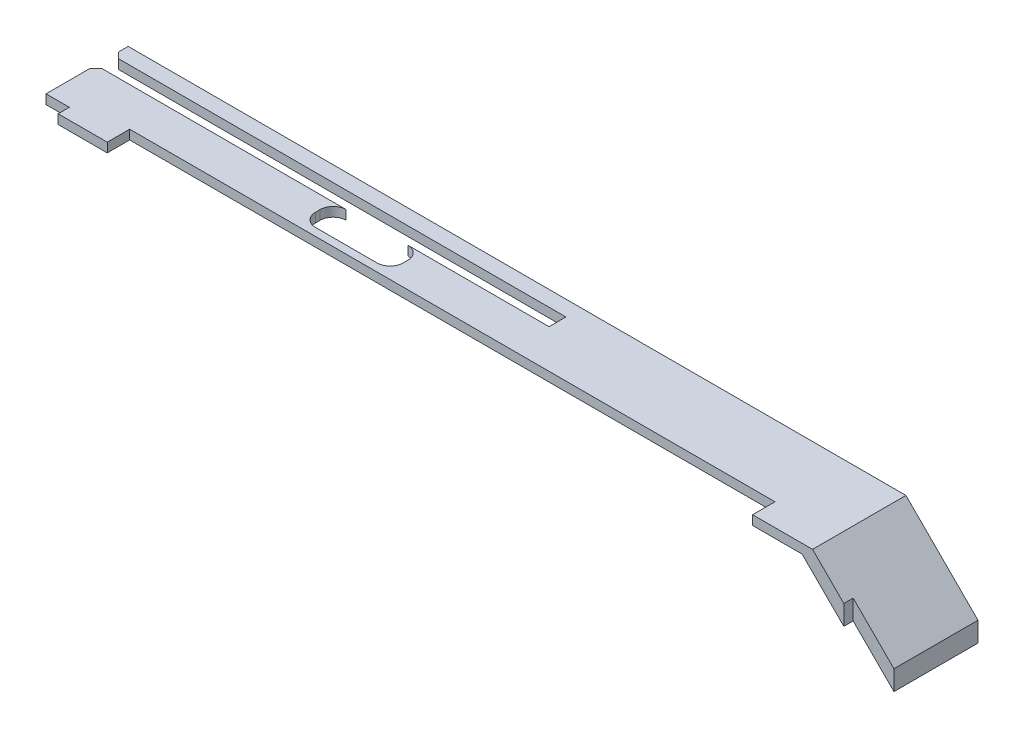
ISO-10303-21;
HEADER;
FILE_DESCRIPTION(('STEP AP214'),'2;1');
FILE_NAME('part.step','',(''),(''),'','','');
FILE_SCHEMA(('AUTOMOTIVE_DESIGN { 1 0 10303 214 1 1 1 1 }'));
ENDSEC;
DATA;
#1=APPLICATION_CONTEXT('core data for automotive mechanical design processes');
#2=APPLICATION_PROTOCOL_DEFINITION('international standard','automotive_design',2000,#1);
#3=PRODUCT_CONTEXT('',#1,'mechanical');
#4=PRODUCT('Part','Part','',(#3));
#5=PRODUCT_RELATED_PRODUCT_CATEGORY('part','',(#4));
#6=PRODUCT_DEFINITION_FORMATION('','',#4);
#7=PRODUCT_DEFINITION_CONTEXT('part definition',#1,'design');
#8=PRODUCT_DEFINITION('design','',#6,#7);
#9=PRODUCT_DEFINITION_SHAPE('','',#8);
#10=(LENGTH_UNIT() NAMED_UNIT(*) SI_UNIT(.MILLI.,.METRE.));
#11=(NAMED_UNIT(*) PLANE_ANGLE_UNIT() SI_UNIT($,.RADIAN.));
#12=(NAMED_UNIT(*) SI_UNIT($,.STERADIAN.) SOLID_ANGLE_UNIT());
#13=UNCERTAINTY_MEASURE_WITH_UNIT(LENGTH_MEASURE(1.E-05),#10,'distance_accuracy_value','');
#14=(GEOMETRIC_REPRESENTATION_CONTEXT(3) GLOBAL_UNCERTAINTY_ASSIGNED_CONTEXT((#13)) GLOBAL_UNIT_ASSIGNED_CONTEXT((#10,
#11,#12)) REPRESENTATION_CONTEXT('',''));
#15=CARTESIAN_POINT('',(0.,0.,0.));
#16=DIRECTION('',(0.,0.,1.));
#17=DIRECTION('',(1.,0.,0.));
#18=AXIS2_PLACEMENT_3D('',#15,#16,#17);
#19=CARTESIAN_POINT('',(-14.635948,0.162679656440347,-15.94625));
#20=DIRECTION('',(0.,0.,1.));
#21=DIRECTION('',(1.,0.,0.));
#22=AXIS2_PLACEMENT_3D('',#19,#20,#21);
#23=PLANE('',#22);
#24=DIRECTION('',(1.,0.,0.));
#25=VECTOR('',#24,1.);
#26=CARTESIAN_POINT('',(-14.635948,9.,-15.94625));
#27=LINE('',#26,#25);
#28=CARTESIAN_POINT('',(-14.035948,9.,-15.94625));
#29=VERTEX_POINT('',#28);
#30=CARTESIAN_POINT('',(12.1700373255554,8.99999999999999,-15.94625));
#31=VERTEX_POINT('',#30);
#32=EDGE_CURVE('E409',#29,#31,#27,.T.);
#33=ORIENTED_EDGE('',*,*,#32,.F.);
#34=DIRECTION('',(0.,1.,0.));
#35=VECTOR('',#34,1.);
#36=CARTESIAN_POINT('',(-14.035948,0.162679656440347,-15.94625));
#37=LINE('',#36,#35);
#38=CARTESIAN_POINT('',(-14.035948,10.,-15.94625));
#39=VERTEX_POINT('',#38);
#40=EDGE_CURVE('E48',#29,#39,#37,.T.);
#41=ORIENTED_EDGE('',*,*,#40,.T.);
#42=DIRECTION('',(1.,0.,0.));
#43=VECTOR('',#42,1.);
#44=CARTESIAN_POINT('',(-14.635948,10.,-15.94625));
#45=LINE('',#44,#43);
#46=CARTESIAN_POINT('',(12.1700373255554,10.,-15.94625));
#47=VERTEX_POINT('',#46);
#48=EDGE_CURVE('E281',#39,#47,#45,.T.);
#49=ORIENTED_EDGE('',*,*,#48,.T.);
#50=DIRECTION('',(0.,1.,0.));
#51=VECTOR('',#50,1.);
#52=CARTESIAN_POINT('',(12.1700373255554,0.162679656440347,-15.94625));
#53=LINE('',#52,#51);
#54=EDGE_CURVE('E244',#31,#47,#53,.T.);
#55=ORIENTED_EDGE('',*,*,#54,.F.);
#56=EDGE_LOOP('',(#33,#41,#49,#55));
#57=FACE_BOUND('',#56,.T.);
#58=ADVANCED_FACE('F39',(#57),#23,.F.);
#59=CARTESIAN_POINT('',(-14.635948,10.,-19.40625));
#60=DIRECTION('',(1.,0.,0.));
#61=DIRECTION('',(0.,0.,-1.));
#62=AXIS2_PLACEMENT_3D('',#59,#60,#61);
#63=PLANE('',#62);
#64=DIRECTION('',(0.,0.,1.));
#65=VECTOR('',#64,1.);
#66=CARTESIAN_POINT('',(-14.635948,9.,-19.40625));
#67=LINE('',#66,#65);
#68=CARTESIAN_POINT('',(-14.635948,9.,-19.40625));
#69=VERTEX_POINT('',#68);
#70=CARTESIAN_POINT('',(-14.635948,9.,-18.34625));
#71=VERTEX_POINT('',#70);
#72=EDGE_CURVE('E329',#69,#71,#67,.T.);
#73=ORIENTED_EDGE('',*,*,#72,.T.);
#74=DIRECTION('',(0.,1.,0.));
#75=VECTOR('',#74,1.);
#76=CARTESIAN_POINT('',(-14.635948,10.,-18.34625));
#77=LINE('',#76,#75);
#78=CARTESIAN_POINT('',(-14.635948,10.,-18.34625));
#79=VERTEX_POINT('',#78);
#80=EDGE_CURVE('E434',#71,#79,#77,.T.);
#81=ORIENTED_EDGE('',*,*,#80,.T.);
#82=DIRECTION('',(0.,0.,1.));
#83=VECTOR('',#82,1.);
#84=CARTESIAN_POINT('',(-14.635948,10.,-19.40625));
#85=LINE('',#84,#83);
#86=CARTESIAN_POINT('',(-14.635948,10.,-19.40625));
#87=VERTEX_POINT('',#86);
#88=EDGE_CURVE('E359',#87,#79,#85,.T.);
#89=ORIENTED_EDGE('',*,*,#88,.F.);
#90=DIRECTION('',(0.,-1.,0.));
#91=VECTOR('',#90,1.);
#92=CARTESIAN_POINT('',(-14.635948,10.,-19.40625));
#93=LINE('',#92,#91);
#94=EDGE_CURVE('E390',#87,#69,#93,.T.);
#95=ORIENTED_EDGE('',*,*,#94,.T.);
#96=EDGE_LOOP('',(#73,#81,#89,#95));
#97=FACE_BOUND('',#96,.T.);
#98=ADVANCED_FACE('F460',(#97),#63,.F.);
#99=CARTESIAN_POINT('',(-12.135948,10.,-9.40624999999999));
#100=DIRECTION('',(0.,0.,-1.));
#101=DIRECTION('',(-1.,0.,0.));
#102=AXIS2_PLACEMENT_3D('',#99,#100,#101);
#103=PLANE('',#102);
#104=DIRECTION('',(-1.,0.,0.));
#105=VECTOR('',#104,1.);
#106=CARTESIAN_POINT('',(-14.635948,9.,-9.40624999999999));
#107=LINE('',#106,#105);
#108=CARTESIAN_POINT('',(-6.875948,9.,-9.40624999999999));
#109=VERTEX_POINT('',#108);
#110=CARTESIAN_POINT('',(-12.135948,9.,-9.40624999999999));
#111=VERTEX_POINT('',#110);
#112=EDGE_CURVE('E326',#109,#111,#107,.T.);
#113=ORIENTED_EDGE('',*,*,#112,.F.);
#114=DIRECTION('',(0.,1.,0.));
#115=VECTOR('',#114,1.);
#116=CARTESIAN_POINT('',(-6.875948,0.162679656440347,-9.40624999999999));
#117=LINE('',#116,#115);
#118=CARTESIAN_POINT('',(-6.875948,10.,-9.40624999999999));
#119=VERTEX_POINT('',#118);
#120=EDGE_CURVE('E296',#109,#119,#117,.T.);
#121=ORIENTED_EDGE('',*,*,#120,.T.);
#122=DIRECTION('',(1.,0.,0.));
#123=VECTOR('',#122,1.);
#124=CARTESIAN_POINT('',(-12.135948,10.,-9.40624999999999));
#125=LINE('',#124,#123);
#126=CARTESIAN_POINT('',(-12.135948,10.,-9.40624999999999));
#127=VERTEX_POINT('',#126);
#128=EDGE_CURVE('E366',#127,#119,#125,.T.);
#129=ORIENTED_EDGE('',*,*,#128,.F.);
#130=DIRECTION('',(0.,-1.,0.));
#131=VECTOR('',#130,1.);
#132=CARTESIAN_POINT('',(-12.135948,10.,-9.40624999999999));
#133=LINE('',#132,#131);
#134=EDGE_CURVE('E381',#127,#111,#133,.T.);
#135=ORIENTED_EDGE('',*,*,#134,.T.);
#136=EDGE_LOOP('',(#113,#121,#129,#135));
#137=FACE_BOUND('',#136,.T.);
#138=ADVANCED_FACE('F466',(#137),#103,.F.);
#139=CARTESIAN_POINT('',(76.364052,10.,-19.40625));
#140=DIRECTION('',(0.,0.,1.));
#141=DIRECTION('',(1.,0.,0.));
#142=AXIS2_PLACEMENT_3D('',#139,#140,#141);
#143=PLANE('',#142);
#144=DIRECTION('',(-1.,0.,0.));
#145=VECTOR('',#144,1.);
#146=CARTESIAN_POINT('',(76.364052,10.,-19.40625));
#147=LINE('',#146,#145);
#148=CARTESIAN_POINT('',(68.648052,10.,-19.40625));
#149=VERTEX_POINT('',#148);
#150=EDGE_CURVE('E356',#149,#87,#147,.T.);
#151=ORIENTED_EDGE('',*,*,#150,.F.);
#152=DIRECTION('',(0.707106781186547,-0.707106781186548,0.));
#153=VECTOR('',#152,1.);
#154=CARTESIAN_POINT('',(78.3326250337006,0.315426966299424,-19.40625));
#155=LINE('',#154,#153);
#156=CARTESIAN_POINT('',(76.364052,2.28399999999999,-19.40625));
#157=VERTEX_POINT('',#156);
#158=EDGE_CURVE('E293',#149,#157,#155,.T.);
#159=ORIENTED_EDGE('',*,*,#158,.T.);
#160=DIRECTION('',(0.,-1.,0.));
#161=VECTOR('',#160,1.);
#162=CARTESIAN_POINT('',(76.364052,10.,-19.40625));
#163=LINE('',#162,#161);
#164=CARTESIAN_POINT('',(76.364052,0.162679656440347,-19.40625));
#165=VERTEX_POINT('',#164);
#166=EDGE_CURVE('E369',#157,#165,#163,.T.);
#167=ORIENTED_EDGE('',*,*,#166,.T.);
#168=DIRECTION('',(-0.707106781186546,0.707106781186549,0.));
#169=VECTOR('',#168,1.);
#170=CARTESIAN_POINT('',(67.5267316564404,9.,-19.40625));
#171=LINE('',#170,#169);
#172=CARTESIAN_POINT('',(67.5267316564404,9.,-19.40625));
#173=VERTEX_POINT('',#172);
#174=EDGE_CURVE('E317',#165,#173,#171,.T.);
#175=ORIENTED_EDGE('',*,*,#174,.T.);
#176=DIRECTION('',(-1.,0.,0.));
#177=VECTOR('',#176,1.);
#178=CARTESIAN_POINT('',(-14.635948,9.,-19.40625));
#179=LINE('',#178,#177);
#180=EDGE_CURVE('E320',#173,#69,#179,.T.);
#181=ORIENTED_EDGE('',*,*,#180,.T.);
#182=ORIENTED_EDGE('',*,*,#94,.F.);
#183=EDGE_LOOP('',(#151,#159,#167,#175,#181,#182));
#184=FACE_BOUND('',#183,.T.);
#185=ADVANCED_FACE('F507',(#184),#143,.F.);
#186=CARTESIAN_POINT('',(-14.635948,10.,-15.34625));
#187=VERTEX_POINT('',#186);
#188=CARTESIAN_POINT('',(-14.635948,10.,-10.60625));
#189=VERTEX_POINT('',#188);
#190=EDGE_CURVE('E358',#187,#189,#85,.T.);
#191=ORIENTED_EDGE('',*,*,#190,.F.);
#192=DIRECTION('',(0.,-1.,0.));
#193=VECTOR('',#192,1.);
#194=CARTESIAN_POINT('',(-14.635948,10.,-15.34625));
#195=LINE('',#194,#193);
#196=CARTESIAN_POINT('',(-14.635948,9.,-15.34625));
#197=VERTEX_POINT('',#196);
#198=EDGE_CURVE('E11',#187,#197,#195,.T.);
#199=ORIENTED_EDGE('',*,*,#198,.T.);
#200=CARTESIAN_POINT('',(-14.635948,9.,-10.60625));
#201=VERTEX_POINT('',#200);
#202=EDGE_CURVE('E333',#197,#201,#67,.T.);
#203=ORIENTED_EDGE('',*,*,#202,.T.);
#204=DIRECTION('',(0.,-1.,0.));
#205=VECTOR('',#204,1.);
#206=CARTESIAN_POINT('',(-14.635948,10.,-10.60625));
#207=LINE('',#206,#205);
#208=EDGE_CURVE('E387',#189,#201,#207,.T.);
#209=ORIENTED_EDGE('',*,*,#208,.F.);
#210=EDGE_LOOP('',(#191,#199,#203,#209));
#211=FACE_BOUND('',#210,.T.);
#212=ADVANCED_FACE('F450',(#211),#63,.F.);
#213=CARTESIAN_POINT('',(-14.635948,10.,-10.60625));
#214=DIRECTION('',(0.,0.,-1.));
#215=DIRECTION('',(-1.,0.,0.));
#216=AXIS2_PLACEMENT_3D('',#213,#214,#215);
#217=PLANE('',#216);
#218=ORIENTED_EDGE('',*,*,#208,.T.);
#219=DIRECTION('',(1.,0.,0.));
#220=VECTOR('',#219,1.);
#221=CARTESIAN_POINT('',(-14.635948,9.,-10.60625));
#222=LINE('',#221,#220);
#223=CARTESIAN_POINT('',(-12.135948,9.,-10.60625));
#224=VERTEX_POINT('',#223);
#225=EDGE_CURVE('E353',#201,#224,#222,.T.);
#226=ORIENTED_EDGE('',*,*,#225,.T.);
#227=DIRECTION('',(0.,-1.,0.));
#228=VECTOR('',#227,1.);
#229=CARTESIAN_POINT('',(-12.135948,10.,-10.60625));
#230=LINE('',#229,#228);
#231=CARTESIAN_POINT('',(-12.135948,10.,-10.60625));
#232=VERTEX_POINT('',#231);
#233=EDGE_CURVE('E384',#232,#224,#230,.T.);
#234=ORIENTED_EDGE('',*,*,#233,.F.);
#235=DIRECTION('',(1.,0.,0.));
#236=VECTOR('',#235,1.);
#237=CARTESIAN_POINT('',(-14.635948,10.,-10.60625));
#238=LINE('',#237,#236);
#239=EDGE_CURVE('E361',#189,#232,#238,.T.);
#240=ORIENTED_EDGE('',*,*,#239,.F.);
#241=EDGE_LOOP('',(#218,#226,#234,#240));
#242=FACE_BOUND('',#241,.T.);
#243=ADVANCED_FACE('F539',(#242),#217,.F.);
#244=CARTESIAN_POINT('',(-12.135948,10.,-10.60625));
#245=DIRECTION('',(1.,0.,0.));
#246=DIRECTION('',(0.,0.,-1.));
#247=AXIS2_PLACEMENT_3D('',#244,#245,#246);
#248=PLANE('',#247);
#249=ORIENTED_EDGE('',*,*,#233,.T.);
#250=DIRECTION('',(0.,0.,1.));
#251=VECTOR('',#250,1.);
#252=CARTESIAN_POINT('',(-12.135948,9.,-10.60625));
#253=LINE('',#252,#251);
#254=EDGE_CURVE('E350',#224,#111,#253,.T.);
#255=ORIENTED_EDGE('',*,*,#254,.T.);
#256=ORIENTED_EDGE('',*,*,#134,.F.);
#257=DIRECTION('',(0.,0.,1.));
#258=VECTOR('',#257,1.);
#259=CARTESIAN_POINT('',(-12.135948,10.,-10.60625));
#260=LINE('',#259,#258);
#261=EDGE_CURVE('E363',#232,#127,#260,.T.);
#262=ORIENTED_EDGE('',*,*,#261,.F.);
#263=EDGE_LOOP('',(#249,#255,#256,#262));
#264=FACE_BOUND('',#263,.T.);
#265=ADVANCED_FACE('F535',(#264),#248,.F.);
#266=CARTESIAN_POINT('',(62.224052,10.,-9.40624999999999));
#267=VERTEX_POINT('',#266);
#268=CARTESIAN_POINT('',(68.648052,10.,-9.40624999999999));
#269=VERTEX_POINT('',#268);
#270=EDGE_CURVE('E365',#267,#269,#125,.T.);
#271=ORIENTED_EDGE('',*,*,#270,.F.);
#272=DIRECTION('',(0.,1.,0.));
#273=VECTOR('',#272,1.);
#274=CARTESIAN_POINT('',(62.224052,0.162679656440347,-9.40624999999999));
#275=LINE('',#274,#273);
#276=CARTESIAN_POINT('',(62.224052,9.,-9.40624999999999));
#277=VERTEX_POINT('',#276);
#278=EDGE_CURVE('E300',#277,#267,#275,.T.);
#279=ORIENTED_EDGE('',*,*,#278,.F.);
#280=CARTESIAN_POINT('',(67.5267316564404,9.,-9.40624999999999));
#281=VERTEX_POINT('',#280);
#282=EDGE_CURVE('E321',#281,#277,#107,.T.);
#283=ORIENTED_EDGE('',*,*,#282,.F.);
#284=DIRECTION('',(-0.707106781186546,0.707106781186549,0.));
#285=VECTOR('',#284,1.);
#286=CARTESIAN_POINT('',(67.5267316564404,9.,-9.40624999999999));
#287=LINE('',#286,#285);
#288=CARTESIAN_POINT('',(71.996502,4.53022965644036,-9.40624999999999));
#289=VERTEX_POINT('',#288);
#290=EDGE_CURVE('E314',#289,#281,#287,.T.);
#291=ORIENTED_EDGE('',*,*,#290,.F.);
#292=DIRECTION('',(0.,-1.,0.));
#293=VECTOR('',#292,1.);
#294=CARTESIAN_POINT('',(71.996502,10.,-9.40624999999999));
#295=LINE('',#294,#293);
#296=CARTESIAN_POINT('',(71.996502,6.65155,-9.40624999999999));
#297=VERTEX_POINT('',#296);
#298=EDGE_CURVE('E378',#297,#289,#295,.T.);
#299=ORIENTED_EDGE('',*,*,#298,.F.);
#300=DIRECTION('',(0.707106781186547,-0.707106781186548,0.));
#301=VECTOR('',#300,1.);
#302=CARTESIAN_POINT('',(78.3326250337006,0.315426966299424,-9.40624999999999));
#303=LINE('',#302,#301);
#304=EDGE_CURVE('E312',#269,#297,#303,.T.);
#305=ORIENTED_EDGE('',*,*,#304,.F.);
#306=EDGE_LOOP('',(#271,#279,#283,#291,#299,#305));
#307=FACE_BOUND('',#306,.T.);
#308=ADVANCED_FACE('F516',(#307),#103,.F.);
#309=CARTESIAN_POINT('',(71.996502,10.,-9.40624999999999));
#310=DIRECTION('',(-1.,0.,0.));
#311=DIRECTION('',(0.,0.,1.));
#312=AXIS2_PLACEMENT_3D('',#309,#310,#311);
#313=PLANE('',#312);
#314=DIRECTION('',(0.,-1.,0.));
#315=VECTOR('',#314,1.);
#316=CARTESIAN_POINT('',(71.996502,10.,-10.40625));
#317=LINE('',#316,#315);
#318=CARTESIAN_POINT('',(71.996502,6.65155,-10.40625));
#319=VERTEX_POINT('',#318);
#320=CARTESIAN_POINT('',(71.996502,4.53022965644036,-10.40625));
#321=VERTEX_POINT('',#320);
#322=EDGE_CURVE('E375',#319,#321,#317,.T.);
#323=ORIENTED_EDGE('',*,*,#322,.F.);
#324=DIRECTION('',(0.,0.,1.));
#325=VECTOR('',#324,1.);
#326=CARTESIAN_POINT('',(71.996502,6.65155,-9.40624999999999));
#327=LINE('',#326,#325);
#328=EDGE_CURVE('E341',#319,#297,#327,.T.);
#329=ORIENTED_EDGE('',*,*,#328,.T.);
#330=ORIENTED_EDGE('',*,*,#298,.T.);
#331=DIRECTION('',(0.,0.,-1.));
#332=VECTOR('',#331,1.);
#333=CARTESIAN_POINT('',(71.996502,4.53022965644036,-9.40624999999999));
#334=LINE('',#333,#332);
#335=EDGE_CURVE('E347',#289,#321,#334,.T.);
#336=ORIENTED_EDGE('',*,*,#335,.T.);
#337=EDGE_LOOP('',(#323,#329,#330,#336));
#338=FACE_BOUND('',#337,.T.);
#339=ADVANCED_FACE('F562',(#338),#313,.F.);
#340=CARTESIAN_POINT('',(71.996502,10.,-10.40625));
#341=DIRECTION('',(0.,0.,-1.));
#342=DIRECTION('',(-1.,0.,0.));
#343=AXIS2_PLACEMENT_3D('',#340,#341,#342);
#344=PLANE('',#343);
#345=DIRECTION('',(0.,-1.,0.));
#346=VECTOR('',#345,1.);
#347=CARTESIAN_POINT('',(76.364052,10.,-10.40625));
#348=LINE('',#347,#346);
#349=CARTESIAN_POINT('',(76.364052,2.28399999999999,-10.40625));
#350=VERTEX_POINT('',#349);
#351=CARTESIAN_POINT('',(76.364052,0.162679656440347,-10.40625));
#352=VERTEX_POINT('',#351);
#353=EDGE_CURVE('E372',#350,#352,#348,.T.);
#354=ORIENTED_EDGE('',*,*,#353,.F.);
#355=DIRECTION('',(-0.707106781186547,0.707106781186548,0.));
#356=VECTOR('',#355,1.);
#357=CARTESIAN_POINT('',(70.322277,8.325775,-10.40625));
#358=LINE('',#357,#356);
#359=EDGE_CURVE('E338',#350,#319,#358,.T.);
#360=ORIENTED_EDGE('',*,*,#359,.T.);
#361=ORIENTED_EDGE('',*,*,#322,.T.);
#362=DIRECTION('',(0.707106781186546,-0.707106781186549,0.));
#363=VECTOR('',#362,1.);
#364=CARTESIAN_POINT('',(69.2616168282202,7.26511482822019,-10.40625));
#365=LINE('',#364,#363);
#366=EDGE_CURVE('E344',#321,#352,#365,.T.);
#367=ORIENTED_EDGE('',*,*,#366,.T.);
#368=EDGE_LOOP('',(#354,#360,#361,#367));
#369=FACE_BOUND('',#368,.T.);
#370=ADVANCED_FACE('F566',(#369),#344,.F.);
#371=CARTESIAN_POINT('',(76.364052,10.,-10.40625));
#372=DIRECTION('',(-1.,0.,0.));
#373=DIRECTION('',(0.,0.,1.));
#374=AXIS2_PLACEMENT_3D('',#371,#372,#373);
#375=PLANE('',#374);
#376=ORIENTED_EDGE('',*,*,#166,.F.);
#377=DIRECTION('',(0.,0.,1.));
#378=VECTOR('',#377,1.);
#379=CARTESIAN_POINT('',(76.364052,2.28399999999999,-10.40625));
#380=LINE('',#379,#378);
#381=EDGE_CURVE('E332',#157,#350,#380,.T.);
#382=ORIENTED_EDGE('',*,*,#381,.T.);
#383=ORIENTED_EDGE('',*,*,#353,.T.);
#384=DIRECTION('',(0.,0.,-1.));
#385=VECTOR('',#384,1.);
#386=CARTESIAN_POINT('',(76.364052,0.162679656440347,-10.40625));
#387=LINE('',#386,#385);
#388=EDGE_CURVE('E396',#352,#165,#387,.T.);
#389=ORIENTED_EDGE('',*,*,#388,.T.);
#390=EDGE_LOOP('',(#376,#382,#383,#389));
#391=FACE_BOUND('',#390,.T.);
#392=ADVANCED_FACE('F571',(#391),#375,.F.);
#393=CARTESIAN_POINT('',(0.,10.,0.));
#394=DIRECTION('',(0.,1.,0.));
#395=DIRECTION('',(0.,0.,1.));
#396=AXIS2_PLACEMENT_3D('',#393,#394,#395);
#397=PLANE('',#396);
#398=ORIENTED_EDGE('',*,*,#88,.T.);
#399=DIRECTION('',(-0.707106781186556,0.,-0.707106781186539));
#400=VECTOR('',#399,1.);
#401=CARTESIAN_POINT('',(1.85515100000018,10.,-1.85515100000022));
#402=LINE('',#401,#400);
#403=CARTESIAN_POINT('',(-14.035948,10.,-17.74625));
#404=VERTEX_POINT('',#403);
#405=EDGE_CURVE('E439',#79,#404,#402,.F.);
#406=ORIENTED_EDGE('',*,*,#405,.T.);
#407=DIRECTION('',(-1.,0.,0.));
#408=VECTOR('',#407,1.);
#409=CARTESIAN_POINT('',(-14.635948,10.,-17.74625));
#410=LINE('',#409,#408);
#411=CARTESIAN_POINT('',(33.894052,10.,-17.74625));
#412=VERTEX_POINT('',#411);
#413=EDGE_CURVE('E287',#412,#404,#410,.T.);
#414=ORIENTED_EDGE('',*,*,#413,.F.);
#415=DIRECTION('',(0.,0.,-1.));
#416=VECTOR('',#415,1.);
#417=CARTESIAN_POINT('',(33.894052,10.,-17.74625));
#418=LINE('',#417,#416);
#419=CARTESIAN_POINT('',(33.894052,10.,-15.94625));
#420=VERTEX_POINT('',#419);
#421=EDGE_CURVE('E283',#420,#412,#418,.T.);
#422=ORIENTED_EDGE('',*,*,#421,.F.);
#423=CARTESIAN_POINT('',(18.7700373255554,10.,-15.94625));
#424=VERTEX_POINT('',#423);
#425=EDGE_CURVE('E284',#424,#420,#45,.T.);
#426=ORIENTED_EDGE('',*,*,#425,.F.);
#427=CARTESIAN_POINT('',(18.7700373255554,10.,-14.54625));
#428=DIRECTION('',(0.,1.,0.));
#429=DIRECTION('',(0.,0.,-1.));
#430=AXIS2_PLACEMENT_3D('',#427,#428,#429);
#431=CIRCLE('',#430,1.4);
#432=CARTESIAN_POINT('',(20.1700373255554,10.,-14.54625));
#433=VERTEX_POINT('',#432);
#434=EDGE_CURVE('E237',#433,#424,#431,.T.);
#435=ORIENTED_EDGE('',*,*,#434,.F.);
#436=DIRECTION('',(0.,0.,-1.));
#437=VECTOR('',#436,1.);
#438=CARTESIAN_POINT('',(20.1700373255554,10.,-14.54625));
#439=LINE('',#438,#437);
#440=CARTESIAN_POINT('',(20.1700373255554,10.,-14.0480228252682));
#441=VERTEX_POINT('',#440);
#442=EDGE_CURVE('E262',#441,#433,#439,.T.);
#443=ORIENTED_EDGE('',*,*,#442,.F.);
#444=CARTESIAN_POINT('',(18.7700373255554,10.,-14.0480228252682));
#445=DIRECTION('',(0.,1.,0.));
#446=DIRECTION('',(0.,0.,1.));
#447=AXIS2_PLACEMENT_3D('',#444,#445,#446);
#448=CIRCLE('',#447,1.4);
#449=CARTESIAN_POINT('',(18.7700373255554,10.,-12.6480228252682));
#450=VERTEX_POINT('',#449);
#451=EDGE_CURVE('E259',#450,#441,#448,.T.);
#452=ORIENTED_EDGE('',*,*,#451,.F.);
#453=DIRECTION('',(1.,0.,0.));
#454=VECTOR('',#453,1.);
#455=CARTESIAN_POINT('',(12.1700373255554,10.,-12.6480228252682));
#456=LINE('',#455,#454);
#457=CARTESIAN_POINT('',(12.1700373255554,10.,-12.6480228252682));
#458=VERTEX_POINT('',#457);
#459=EDGE_CURVE('E254',#458,#450,#456,.T.);
#460=ORIENTED_EDGE('',*,*,#459,.F.);
#461=CARTESIAN_POINT('',(12.1700373255554,10.,-14.0480228252682));
#462=DIRECTION('',(0.,1.,0.));
#463=DIRECTION('',(0.,0.,1.));
#464=AXIS2_PLACEMENT_3D('',#461,#462,#463);
#465=CIRCLE('',#464,1.4);
#466=CARTESIAN_POINT('',(10.7700373255554,10.,-14.0480228252682));
#467=VERTEX_POINT('',#466);
#468=EDGE_CURVE('E252',#467,#458,#465,.T.);
#469=ORIENTED_EDGE('',*,*,#468,.F.);
#470=DIRECTION('',(0.,0.,1.));
#471=VECTOR('',#470,1.);
#472=CARTESIAN_POINT('',(10.7700373255554,10.,-14.54625));
#473=LINE('',#472,#471);
#474=CARTESIAN_POINT('',(10.7700373255554,10.,-14.54625));
#475=VERTEX_POINT('',#474);
#476=EDGE_CURVE('E229',#475,#467,#473,.T.);
#477=ORIENTED_EDGE('',*,*,#476,.F.);
#478=CARTESIAN_POINT('',(12.1700373255554,10.,-14.54625));
#479=DIRECTION('',(0.,1.,0.));
#480=DIRECTION('',(0.,0.,1.));
#481=AXIS2_PLACEMENT_3D('',#478,#479,#480);
#482=CIRCLE('',#481,1.4);
#483=EDGE_CURVE('E241',#47,#475,#482,.T.);
#484=ORIENTED_EDGE('',*,*,#483,.F.);
#485=ORIENTED_EDGE('',*,*,#48,.F.);
#486=DIRECTION('',(0.707106781186548,0.,-0.707106781186548));
#487=VECTOR('',#486,1.);
#488=CARTESIAN_POINT('',(-14.991099,10.,-14.991099));
#489=LINE('',#488,#487);
#490=EDGE_CURVE('E437',#39,#187,#489,.F.);
#491=ORIENTED_EDGE('',*,*,#490,.T.);
#492=ORIENTED_EDGE('',*,*,#190,.T.);
#493=ORIENTED_EDGE('',*,*,#239,.T.);
#494=ORIENTED_EDGE('',*,*,#261,.T.);
#495=ORIENTED_EDGE('',*,*,#128,.T.);
#496=DIRECTION('',(0.,0.,1.));
#497=VECTOR('',#496,1.);
#498=CARTESIAN_POINT('',(-6.875948,10.,-9.40624999999999));
#499=LINE('',#498,#497);
#500=CARTESIAN_POINT('',(-6.875948,10.,-11.80625));
#501=VERTEX_POINT('',#500);
#502=EDGE_CURVE('E310',#501,#119,#499,.T.);
#503=ORIENTED_EDGE('',*,*,#502,.F.);
#504=DIRECTION('',(-1.,0.,0.));
#505=VECTOR('',#504,1.);
#506=CARTESIAN_POINT('',(-6.875948,10.,-11.80625));
#507=LINE('',#506,#505);
#508=CARTESIAN_POINT('',(62.224052,10.,-11.80625));
#509=VERTEX_POINT('',#508);
#510=EDGE_CURVE('E299',#509,#501,#507,.T.);
#511=ORIENTED_EDGE('',*,*,#510,.F.);
#512=DIRECTION('',(0.,0.,-1.));
#513=VECTOR('',#512,1.);
#514=CARTESIAN_POINT('',(62.224052,10.,-9.40624999999999));
#515=LINE('',#514,#513);
#516=EDGE_CURVE('E307',#267,#509,#515,.T.);
#517=ORIENTED_EDGE('',*,*,#516,.F.);
#518=ORIENTED_EDGE('',*,*,#270,.T.);
#519=DIRECTION('',(0.,0.,1.));
#520=VECTOR('',#519,1.);
#521=CARTESIAN_POINT('',(68.648052,10.,0.));
#522=LINE('',#521,#520);
#523=EDGE_CURVE('E393',#149,#269,#522,.T.);
#524=ORIENTED_EDGE('',*,*,#523,.F.);
#525=ORIENTED_EDGE('',*,*,#150,.T.);
#526=EDGE_LOOP('',(#398,#406,#414,#422,#426,#435,#443,#452,#460,#469,#477,#484,#485,#491,#492,
#493,#494,#495,#503,#511,#517,#518,#524,#525));
#527=FACE_BOUND('',#526,.T.);
#528=ADVANCED_FACE('F249',(#527),#397,.T.);
#529=CARTESIAN_POINT('',(78.3326250337006,0.315426966299424,-19.40625));
#530=DIRECTION('',(-0.707106781186548,-0.707106781186547,0.));
#531=DIRECTION('',(0.707106781186547,-0.707106781186548,0.));
#532=AXIS2_PLACEMENT_3D('',#529,#530,#531);
#533=PLANE('',#532);
#534=ORIENTED_EDGE('',*,*,#359,.F.);
#535=ORIENTED_EDGE('',*,*,#381,.F.);
#536=ORIENTED_EDGE('',*,*,#158,.F.);
#537=ORIENTED_EDGE('',*,*,#523,.T.);
#538=ORIENTED_EDGE('',*,*,#304,.T.);
#539=ORIENTED_EDGE('',*,*,#328,.F.);
#540=EDGE_LOOP('',(#534,#535,#536,#537,#538,#539));
#541=FACE_BOUND('',#540,.T.);
#542=ADVANCED_FACE('F581',(#541),#533,.F.);
#543=CARTESIAN_POINT('',(-14.635948,9.,-19.40625));
#544=DIRECTION('',(0.,1.,0.));
#545=DIRECTION('',(0.,0.,1.));
#546=AXIS2_PLACEMENT_3D('',#543,#544,#545);
#547=PLANE('',#546);
#548=DIRECTION('',(-1.,0.,0.));
#549=VECTOR('',#548,1.);
#550=CARTESIAN_POINT('',(-14.635948,9.,-17.74625));
#551=LINE('',#550,#549);
#552=CARTESIAN_POINT('',(33.894052,9.,-17.74625));
#553=VERTEX_POINT('',#552);
#554=CARTESIAN_POINT('',(-14.035948,9.,-17.74625));
#555=VERTEX_POINT('',#554);
#556=EDGE_CURVE('E414',#553,#555,#551,.T.);
#557=ORIENTED_EDGE('',*,*,#556,.T.);
#558=DIRECTION('',(0.707106781186556,0.,0.707106781186539));
#559=VECTOR('',#558,1.);
#560=CARTESIAN_POINT('',(-14.635948,9.,-18.34625));
#561=LINE('',#560,#559);
#562=EDGE_CURVE('E444',#555,#71,#561,.F.);
#563=ORIENTED_EDGE('',*,*,#562,.T.);
#564=ORIENTED_EDGE('',*,*,#72,.F.);
#565=ORIENTED_EDGE('',*,*,#180,.F.);
#566=DIRECTION('',(0.,0.,1.));
#567=VECTOR('',#566,1.);
#568=CARTESIAN_POINT('',(67.5267316564404,9.,-19.40625));
#569=LINE('',#568,#567);
#570=EDGE_CURVE('E324',#173,#281,#569,.T.);
#571=ORIENTED_EDGE('',*,*,#570,.T.);
#572=ORIENTED_EDGE('',*,*,#282,.T.);
#573=DIRECTION('',(0.,0.,-1.));
#574=VECTOR('',#573,1.);
#575=CARTESIAN_POINT('',(62.224052,9.,-19.40625));
#576=LINE('',#575,#574);
#577=CARTESIAN_POINT('',(62.224052,9.,-11.80625));
#578=VERTEX_POINT('',#577);
#579=EDGE_CURVE('E399',#277,#578,#576,.T.);
#580=ORIENTED_EDGE('',*,*,#579,.T.);
#581=DIRECTION('',(-1.,0.,0.));
#582=VECTOR('',#581,1.);
#583=CARTESIAN_POINT('',(-14.635948,9.,-11.80625));
#584=LINE('',#583,#582);
#585=CARTESIAN_POINT('',(-6.875948,9.,-11.80625));
#586=VERTEX_POINT('',#585);
#587=EDGE_CURVE('E402',#578,#586,#584,.T.);
#588=ORIENTED_EDGE('',*,*,#587,.T.);
#589=DIRECTION('',(0.,0.,1.));
#590=VECTOR('',#589,1.);
#591=CARTESIAN_POINT('',(-6.875948,9.,-19.40625));
#592=LINE('',#591,#590);
#593=EDGE_CURVE('E405',#586,#109,#592,.T.);
#594=ORIENTED_EDGE('',*,*,#593,.T.);
#595=ORIENTED_EDGE('',*,*,#112,.T.);
#596=ORIENTED_EDGE('',*,*,#254,.F.);
#597=ORIENTED_EDGE('',*,*,#225,.F.);
#598=ORIENTED_EDGE('',*,*,#202,.F.);
#599=DIRECTION('',(-0.707106781186548,0.,0.707106781186548));
#600=VECTOR('',#599,1.);
#601=CARTESIAN_POINT('',(-14.035948,9.,-15.94625));
#602=LINE('',#601,#600);
#603=EDGE_CURVE('E60',#197,#29,#602,.F.);
#604=ORIENTED_EDGE('',*,*,#603,.T.);
#605=ORIENTED_EDGE('',*,*,#32,.T.);
#606=CARTESIAN_POINT('',(12.1700373255554,9.,-14.54625));
#607=DIRECTION('',(0.,1.,0.));
#608=DIRECTION('',(0.,0.,1.));
#609=AXIS2_PLACEMENT_3D('',#606,#607,#608);
#610=CIRCLE('',#609,1.4);
#611=CARTESIAN_POINT('',(10.7700373255554,9.,-14.54625));
#612=VERTEX_POINT('',#611);
#613=EDGE_CURVE('E278',#31,#612,#610,.T.);
#614=ORIENTED_EDGE('',*,*,#613,.T.);
#615=DIRECTION('',(0.,0.,1.));
#616=VECTOR('',#615,1.);
#617=CARTESIAN_POINT('',(10.7700373255553,9.,-19.4062500000001));
#618=LINE('',#617,#616);
#619=CARTESIAN_POINT('',(10.7700373255554,9.,-14.0480228252682));
#620=VERTEX_POINT('',#619);
#621=EDGE_CURVE('E232',#612,#620,#618,.T.);
#622=ORIENTED_EDGE('',*,*,#621,.T.);
#623=CARTESIAN_POINT('',(12.1700373255554,9.,-14.0480228252682));
#624=DIRECTION('',(0.,1.,0.));
#625=DIRECTION('',(0.,0.,1.));
#626=AXIS2_PLACEMENT_3D('',#623,#624,#625);
#627=CIRCLE('',#626,1.4);
#628=CARTESIAN_POINT('',(12.1700373255554,9.,-12.6480228252682));
#629=VERTEX_POINT('',#628);
#630=EDGE_CURVE('E422',#620,#629,#627,.T.);
#631=ORIENTED_EDGE('',*,*,#630,.T.);
#632=DIRECTION('',(1.,0.,0.));
#633=VECTOR('',#632,1.);
#634=CARTESIAN_POINT('',(-14.635948,9.,-12.6480228252682));
#635=LINE('',#634,#633);
#636=CARTESIAN_POINT('',(18.7700373255554,9.,-12.6480228252682));
#637=VERTEX_POINT('',#636);
#638=EDGE_CURVE('E425',#629,#637,#635,.T.);
#639=ORIENTED_EDGE('',*,*,#638,.T.);
#640=CARTESIAN_POINT('',(18.7700373255554,9.,-14.0480228252682));
#641=DIRECTION('',(0.,1.,0.));
#642=DIRECTION('',(0.,0.,1.));
#643=AXIS2_PLACEMENT_3D('',#640,#641,#642);
#644=CIRCLE('',#643,1.4);
#645=CARTESIAN_POINT('',(20.1700373255554,9.,-14.0480228252682));
#646=VERTEX_POINT('',#645);
#647=EDGE_CURVE('E428',#637,#646,#644,.T.);
#648=ORIENTED_EDGE('',*,*,#647,.T.);
#649=DIRECTION('',(0.,0.,-1.));
#650=VECTOR('',#649,1.);
#651=CARTESIAN_POINT('',(20.1700373255554,9.,-19.4062499999998));
#652=LINE('',#651,#650);
#653=CARTESIAN_POINT('',(20.1700373255554,9.,-14.54625));
#654=VERTEX_POINT('',#653);
#655=EDGE_CURVE('E431',#646,#654,#652,.T.);
#656=ORIENTED_EDGE('',*,*,#655,.T.);
#657=CARTESIAN_POINT('',(18.7700373255554,9.,-14.54625));
#658=DIRECTION('',(0.,1.,0.));
#659=DIRECTION('',(0.,0.,1.));
#660=AXIS2_PLACEMENT_3D('',#657,#658,#659);
#661=CIRCLE('',#660,1.4);
#662=CARTESIAN_POINT('',(18.7700373255554,8.99999999999999,-15.94625));
#663=VERTEX_POINT('',#662);
#664=EDGE_CURVE('E268',#654,#663,#661,.T.);
#665=ORIENTED_EDGE('',*,*,#664,.T.);
#666=CARTESIAN_POINT('',(33.894052,9.,-15.94625));
#667=VERTEX_POINT('',#666);
#668=EDGE_CURVE('E408',#663,#667,#27,.T.);
#669=ORIENTED_EDGE('',*,*,#668,.T.);
#670=DIRECTION('',(0.,0.,-1.));
#671=VECTOR('',#670,1.);
#672=CARTESIAN_POINT('',(33.894052,9.,-19.40625));
#673=LINE('',#672,#671);
#674=EDGE_CURVE('E411',#667,#553,#673,.T.);
#675=ORIENTED_EDGE('',*,*,#674,.T.);
#676=EDGE_LOOP('',(#557,#563,#564,#565,#571,#572,#580,#588,#594,#595,#596,#597,#598,#604,#605,
#614,#622,#631,#639,#648,#656,#665,#669,#675));
#677=FACE_BOUND('',#676,.T.);
#678=ADVANCED_FACE('F488',(#677),#547,.F.);
#679=CARTESIAN_POINT('',(67.5267316564404,9.,-19.40625));
#680=DIRECTION('',(0.707106781186549,0.707106781186546,0.));
#681=DIRECTION('',(-0.707106781186546,0.707106781186549,0.));
#682=AXIS2_PLACEMENT_3D('',#679,#680,#681);
#683=PLANE('',#682);
#684=ORIENTED_EDGE('',*,*,#290,.T.);
#685=ORIENTED_EDGE('',*,*,#570,.F.);
#686=ORIENTED_EDGE('',*,*,#174,.F.);
#687=ORIENTED_EDGE('',*,*,#388,.F.);
#688=ORIENTED_EDGE('',*,*,#366,.F.);
#689=ORIENTED_EDGE('',*,*,#335,.F.);
#690=EDGE_LOOP('',(#684,#685,#686,#687,#688,#689));
#691=FACE_BOUND('',#690,.T.);
#692=ADVANCED_FACE('F582',(#691),#683,.F.);
#693=CARTESIAN_POINT('',(-6.875948,0.162679656440347,-9.40624999999999));
#694=DIRECTION('',(-1.,0.,0.));
#695=DIRECTION('',(0.,0.,1.));
#696=AXIS2_PLACEMENT_3D('',#693,#694,#695);
#697=PLANE('',#696);
#698=DIRECTION('',(0.,1.,0.));
#699=VECTOR('',#698,1.);
#700=CARTESIAN_POINT('',(-6.875948,0.162679656440347,-11.80625));
#701=LINE('',#700,#699);
#702=EDGE_CURVE('E280',#586,#501,#701,.T.);
#703=ORIENTED_EDGE('',*,*,#702,.T.);
#704=ORIENTED_EDGE('',*,*,#502,.T.);
#705=ORIENTED_EDGE('',*,*,#120,.F.);
#706=ORIENTED_EDGE('',*,*,#593,.F.);
#707=EDGE_LOOP('',(#703,#704,#705,#706));
#708=FACE_BOUND('',#707,.T.);
#709=ADVANCED_FACE('F585',(#708),#697,.F.);
#710=CARTESIAN_POINT('',(-6.875948,0.162679656440347,-11.80625));
#711=DIRECTION('',(0.,0.,-1.));
#712=DIRECTION('',(-1.,0.,0.));
#713=AXIS2_PLACEMENT_3D('',#710,#711,#712);
#714=PLANE('',#713);
#715=DIRECTION('',(0.,1.,0.));
#716=VECTOR('',#715,1.);
#717=CARTESIAN_POINT('',(62.224052,0.162679656440347,-11.80625));
#718=LINE('',#717,#716);
#719=EDGE_CURVE('E302',#578,#509,#718,.T.);
#720=ORIENTED_EDGE('',*,*,#719,.T.);
#721=ORIENTED_EDGE('',*,*,#510,.T.);
#722=ORIENTED_EDGE('',*,*,#702,.F.);
#723=ORIENTED_EDGE('',*,*,#587,.F.);
#724=EDGE_LOOP('',(#720,#721,#722,#723));
#725=FACE_BOUND('',#724,.T.);
#726=ADVANCED_FACE('F526',(#725),#714,.F.);
#727=CARTESIAN_POINT('',(62.224052,0.162679656440347,-9.40624999999999));
#728=DIRECTION('',(1.,0.,0.));
#729=DIRECTION('',(0.,0.,-1.));
#730=AXIS2_PLACEMENT_3D('',#727,#728,#729);
#731=PLANE('',#730);
#732=ORIENTED_EDGE('',*,*,#278,.T.);
#733=ORIENTED_EDGE('',*,*,#516,.T.);
#734=ORIENTED_EDGE('',*,*,#719,.F.);
#735=ORIENTED_EDGE('',*,*,#579,.F.);
#736=EDGE_LOOP('',(#732,#733,#734,#735));
#737=FACE_BOUND('',#736,.T.);
#738=ADVANCED_FACE('F521',(#737),#731,.F.);
#739=CARTESIAN_POINT('',(-14.635948,0.162679656440347,-17.74625));
#740=DIRECTION('',(0.,0.,-1.));
#741=DIRECTION('',(-1.,0.,0.));
#742=AXIS2_PLACEMENT_3D('',#739,#740,#741);
#743=PLANE('',#742);
#744=ORIENTED_EDGE('',*,*,#413,.T.);
#745=DIRECTION('',(0.,-1.,0.));
#746=VECTOR('',#745,1.);
#747=CARTESIAN_POINT('',(-14.035948,0.162679656440347,-17.74625));
#748=LINE('',#747,#746);
#749=EDGE_CURVE('E441',#404,#555,#748,.T.);
#750=ORIENTED_EDGE('',*,*,#749,.T.);
#751=ORIENTED_EDGE('',*,*,#556,.F.);
#752=DIRECTION('',(0.,1.,0.));
#753=VECTOR('',#752,1.);
#754=CARTESIAN_POINT('',(33.894052,0.162679656440347,-17.74625));
#755=LINE('',#754,#753);
#756=EDGE_CURVE('E291',#553,#412,#755,.T.);
#757=ORIENTED_EDGE('',*,*,#756,.T.);
#758=EDGE_LOOP('',(#744,#750,#751,#757));
#759=FACE_BOUND('',#758,.T.);
#760=ADVANCED_FACE('F482',(#759),#743,.F.);
#761=CARTESIAN_POINT('',(33.894052,0.162679656440347,-17.74625));
#762=DIRECTION('',(1.,0.,0.));
#763=DIRECTION('',(0.,0.,-1.));
#764=AXIS2_PLACEMENT_3D('',#761,#762,#763);
#765=PLANE('',#764);
#766=DIRECTION('',(0.,1.,0.));
#767=VECTOR('',#766,1.);
#768=CARTESIAN_POINT('',(33.894052,0.162679656440347,-15.94625));
#769=LINE('',#768,#767);
#770=EDGE_CURVE('E290',#667,#420,#769,.T.);
#771=ORIENTED_EDGE('',*,*,#770,.T.);
#772=ORIENTED_EDGE('',*,*,#421,.T.);
#773=ORIENTED_EDGE('',*,*,#756,.F.);
#774=ORIENTED_EDGE('',*,*,#674,.F.);
#775=EDGE_LOOP('',(#771,#772,#773,#774));
#776=FACE_BOUND('',#775,.T.);
#777=ADVANCED_FACE('F473',(#776),#765,.F.);
#778=ORIENTED_EDGE('',*,*,#668,.F.);
#779=DIRECTION('',(0.,1.,0.));
#780=VECTOR('',#779,1.);
#781=CARTESIAN_POINT('',(18.7700373255554,0.162679656440347,-15.94625));
#782=LINE('',#781,#780);
#783=EDGE_CURVE('E417',#663,#424,#782,.T.);
#784=ORIENTED_EDGE('',*,*,#783,.T.);
#785=ORIENTED_EDGE('',*,*,#425,.T.);
#786=ORIENTED_EDGE('',*,*,#770,.F.);
#787=EDGE_LOOP('',(#778,#784,#785,#786));
#788=FACE_BOUND('',#787,.T.);
#789=ADVANCED_FACE('F462',(#788),#23,.F.);
#790=CARTESIAN_POINT('',(20.1700373255554,0.162679656440347,-14.54625));
#791=DIRECTION('',(1.,0.,0.));
#792=DIRECTION('',(0.,0.,-1.));
#793=AXIS2_PLACEMENT_3D('',#790,#791,#792);
#794=PLANE('',#793);
#795=DIRECTION('',(0.,1.,0.));
#796=VECTOR('',#795,1.);
#797=CARTESIAN_POINT('',(20.1700373255554,0.162679656440347,-14.0480228252682));
#798=LINE('',#797,#796);
#799=EDGE_CURVE('E269',#646,#441,#798,.T.);
#800=ORIENTED_EDGE('',*,*,#799,.T.);
#801=ORIENTED_EDGE('',*,*,#442,.T.);
#802=DIRECTION('',(0.,1.,0.));
#803=VECTOR('',#802,1.);
#804=CARTESIAN_POINT('',(20.1700373255554,0.162679656440347,-14.54625));
#805=LINE('',#804,#803);
#806=EDGE_CURVE('E266',#654,#433,#805,.T.);
#807=ORIENTED_EDGE('',*,*,#806,.F.);
#808=ORIENTED_EDGE('',*,*,#655,.F.);
#809=EDGE_LOOP('',(#800,#801,#807,#808));
#810=FACE_BOUND('',#809,.T.);
#811=ADVANCED_FACE('F472',(#810),#794,.F.);
#812=CARTESIAN_POINT('',(18.7700373255554,0.162679656440347,-14.0480228252682));
#813=DIRECTION('',(0.,1.,0.));
#814=DIRECTION('',(0.,0.,1.));
#815=AXIS2_PLACEMENT_3D('',#812,#813,#814);
#816=CYLINDRICAL_SURFACE('',#815,1.4);
#817=DIRECTION('',(0.,1.,0.));
#818=VECTOR('',#817,1.);
#819=CARTESIAN_POINT('',(18.7700373255554,0.162679656440347,-12.6480228252682));
#820=LINE('',#819,#818);
#821=EDGE_CURVE('E271',#637,#450,#820,.T.);
#822=ORIENTED_EDGE('',*,*,#821,.T.);
#823=ORIENTED_EDGE('',*,*,#451,.T.);
#824=ORIENTED_EDGE('',*,*,#799,.F.);
#825=ORIENTED_EDGE('',*,*,#647,.F.);
#826=EDGE_LOOP('',(#822,#823,#824,#825));
#827=FACE_BOUND('',#826,.T.);
#828=ADVANCED_FACE('F479',(#827),#816,.F.);
#829=CARTESIAN_POINT('',(12.1700373255554,0.162679656440347,-12.6480228252682));
#830=DIRECTION('',(0.,0.,1.));
#831=DIRECTION('',(1.,0.,0.));
#832=AXIS2_PLACEMENT_3D('',#829,#830,#831);
#833=PLANE('',#832);
#834=DIRECTION('',(0.,1.,0.));
#835=VECTOR('',#834,1.);
#836=CARTESIAN_POINT('',(12.1700373255554,0.162679656440347,-12.6480228252682));
#837=LINE('',#836,#835);
#838=EDGE_CURVE('E273',#629,#458,#837,.T.);
#839=ORIENTED_EDGE('',*,*,#838,.T.);
#840=ORIENTED_EDGE('',*,*,#459,.T.);
#841=ORIENTED_EDGE('',*,*,#821,.F.);
#842=ORIENTED_EDGE('',*,*,#638,.F.);
#843=EDGE_LOOP('',(#839,#840,#841,#842));
#844=FACE_BOUND('',#843,.T.);
#845=ADVANCED_FACE('F642',(#844),#833,.F.);
#846=CARTESIAN_POINT('',(12.1700373255554,0.162679656440347,-14.0480228252682));
#847=DIRECTION('',(0.,1.,0.));
#848=DIRECTION('',(0.,0.,1.));
#849=AXIS2_PLACEMENT_3D('',#846,#847,#848);
#850=CYLINDRICAL_SURFACE('',#849,1.4);
#851=DIRECTION('',(0.,1.,0.));
#852=VECTOR('',#851,1.);
#853=CARTESIAN_POINT('',(10.7700373255554,0.162679656440347,-14.0480228252682));
#854=LINE('',#853,#852);
#855=EDGE_CURVE('E236',#620,#467,#854,.T.);
#856=ORIENTED_EDGE('',*,*,#855,.T.);
#857=ORIENTED_EDGE('',*,*,#468,.T.);
#858=ORIENTED_EDGE('',*,*,#838,.F.);
#859=ORIENTED_EDGE('',*,*,#630,.F.);
#860=EDGE_LOOP('',(#856,#857,#858,#859));
#861=FACE_BOUND('',#860,.T.);
#862=ADVANCED_FACE('F653',(#861),#850,.F.);
#863=CARTESIAN_POINT('',(10.7700373255554,0.162679656440347,-14.54625));
#864=DIRECTION('',(-1.,0.,0.));
#865=DIRECTION('',(0.,0.,1.));
#866=AXIS2_PLACEMENT_3D('',#863,#864,#865);
#867=PLANE('',#866);
#868=DIRECTION('',(0.,1.,0.));
#869=VECTOR('',#868,1.);
#870=CARTESIAN_POINT('',(10.7700373255554,0.162679656440347,-14.54625));
#871=LINE('',#870,#869);
#872=EDGE_CURVE('E224',#612,#475,#871,.T.);
#873=ORIENTED_EDGE('',*,*,#872,.T.);
#874=ORIENTED_EDGE('',*,*,#476,.T.);
#875=ORIENTED_EDGE('',*,*,#855,.F.);
#876=ORIENTED_EDGE('',*,*,#621,.F.);
#877=EDGE_LOOP('',(#873,#874,#875,#876));
#878=FACE_BOUND('',#877,.T.);
#879=ADVANCED_FACE('F226',(#878),#867,.F.);
#880=CARTESIAN_POINT('',(12.1700373255554,0.162679656440347,-14.54625));
#881=DIRECTION('',(0.,1.,0.));
#882=DIRECTION('',(0.,0.,1.));
#883=AXIS2_PLACEMENT_3D('',#880,#881,#882);
#884=CYLINDRICAL_SURFACE('',#883,1.4);
#885=ORIENTED_EDGE('',*,*,#54,.T.);
#886=ORIENTED_EDGE('',*,*,#483,.T.);
#887=ORIENTED_EDGE('',*,*,#872,.F.);
#888=ORIENTED_EDGE('',*,*,#613,.F.);
#889=EDGE_LOOP('',(#885,#886,#887,#888));
#890=FACE_BOUND('',#889,.T.);
#891=ADVANCED_FACE('F242',(#890),#884,.F.);
#892=CARTESIAN_POINT('',(18.7700373255554,0.162679656440347,-14.54625));
#893=DIRECTION('',(0.,1.,0.));
#894=DIRECTION('',(0.,0.,1.));
#895=AXIS2_PLACEMENT_3D('',#892,#893,#894);
#896=CYLINDRICAL_SURFACE('',#895,1.4);
#897=ORIENTED_EDGE('',*,*,#806,.T.);
#898=ORIENTED_EDGE('',*,*,#434,.T.);
#899=ORIENTED_EDGE('',*,*,#783,.F.);
#900=ORIENTED_EDGE('',*,*,#664,.F.);
#901=EDGE_LOOP('',(#897,#898,#899,#900));
#902=FACE_BOUND('',#901,.T.);
#903=ADVANCED_FACE('F457',(#902),#896,.F.);
#904=CARTESIAN_POINT('',(-14.635948,10.,-18.34625));
#905=DIRECTION('',(0.707106781186539,0.,-0.707106781186556));
#906=DIRECTION('',(0.,1.,0.));
#907=AXIS2_PLACEMENT_3D('',#904,#905,#906);
#908=PLANE('',#907);
#909=ORIENTED_EDGE('',*,*,#562,.F.);
#910=ORIENTED_EDGE('',*,*,#749,.F.);
#911=ORIENTED_EDGE('',*,*,#405,.F.);
#912=ORIENTED_EDGE('',*,*,#80,.F.);
#913=EDGE_LOOP('',(#909,#910,#911,#912));
#914=FACE_BOUND('',#913,.T.);
#915=ADVANCED_FACE('F453',(#914),#908,.F.);
#916=CARTESIAN_POINT('',(-14.035948,0.162679656440347,-15.94625));
#917=DIRECTION('',(0.707106781186548,0.,0.707106781186548));
#918=DIRECTION('',(0.,1.,0.));
#919=AXIS2_PLACEMENT_3D('',#916,#917,#918);
#920=PLANE('',#919);
#921=ORIENTED_EDGE('',*,*,#603,.F.);
#922=ORIENTED_EDGE('',*,*,#198,.F.);
#923=ORIENTED_EDGE('',*,*,#490,.F.);
#924=ORIENTED_EDGE('',*,*,#40,.F.);
#925=EDGE_LOOP('',(#921,#922,#923,#924));
#926=FACE_BOUND('',#925,.T.);
#927=ADVANCED_FACE('F42',(#926),#920,.F.);
#928=CLOSED_SHELL('',(#58,#98,#138,#185,#212,#243,#265,#308,#339,#370,#392,#528,#542,#678,#692,
#709,#726,#738,#760,#777,#789,#811,#828,#845,#862,#879,#891,#903,#915,#927));
#929=MANIFOLD_SOLID_BREP('B2',#928);
#930=ADVANCED_BREP_SHAPE_REPRESENTATION('',(#18,#929),#14);
#931=SHAPE_DEFINITION_REPRESENTATION(#9,#930);
ENDSEC;
END-ISO-10303-21;
